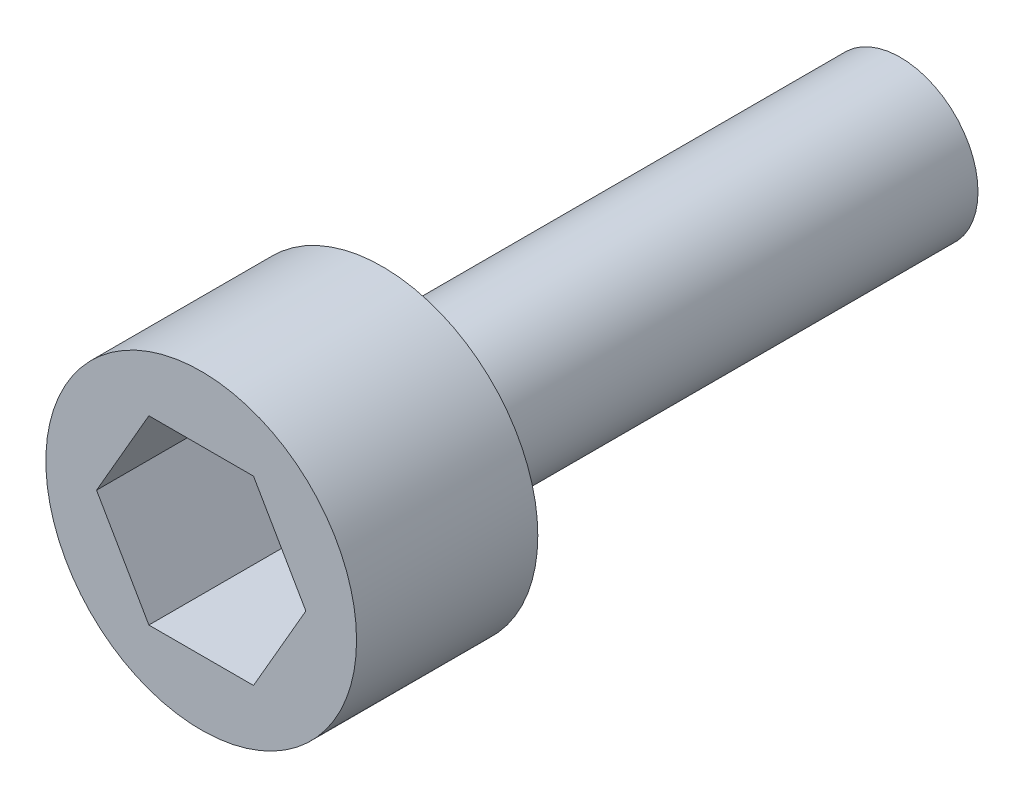
ISO-10303-21;
HEADER;
FILE_DESCRIPTION(('STEP AP214'),'2;1');
FILE_NAME('part.step','',(''),(''),'','','');
FILE_SCHEMA(('AUTOMOTIVE_DESIGN { 1 0 10303 214 1 1 1 1 }'));
ENDSEC;
DATA;
#1=APPLICATION_CONTEXT('core data for automotive mechanical design processes');
#2=APPLICATION_PROTOCOL_DEFINITION('international standard','automotive_design',2000,#1);
#3=PRODUCT_CONTEXT('',#1,'mechanical');
#4=PRODUCT('Part','Part','',(#3));
#5=PRODUCT_RELATED_PRODUCT_CATEGORY('part','',(#4));
#6=PRODUCT_DEFINITION_FORMATION('','',#4);
#7=PRODUCT_DEFINITION_CONTEXT('part definition',#1,'design');
#8=PRODUCT_DEFINITION('design','',#6,#7);
#9=PRODUCT_DEFINITION_SHAPE('','',#8);
#10=(LENGTH_UNIT() NAMED_UNIT(*) SI_UNIT(.MILLI.,.METRE.));
#11=(NAMED_UNIT(*) PLANE_ANGLE_UNIT() SI_UNIT($,.RADIAN.));
#12=(NAMED_UNIT(*) SI_UNIT($,.STERADIAN.) SOLID_ANGLE_UNIT());
#13=UNCERTAINTY_MEASURE_WITH_UNIT(LENGTH_MEASURE(1.E-05),#10,'distance_accuracy_value','');
#14=(GEOMETRIC_REPRESENTATION_CONTEXT(3) GLOBAL_UNCERTAINTY_ASSIGNED_CONTEXT((#13)) GLOBAL_UNIT_ASSIGNED_CONTEXT((#10,
#11,#12)) REPRESENTATION_CONTEXT('',''));
#15=CARTESIAN_POINT('',(0.,0.,0.));
#16=DIRECTION('',(0.,0.,1.));
#17=DIRECTION('',(1.,0.,0.));
#18=AXIS2_PLACEMENT_3D('',#15,#16,#17);
#19=CARTESIAN_POINT('',(0.,0.,3.5));
#20=DIRECTION('',(0.,0.,-1.));
#21=DIRECTION('',(-1.,0.,0.));
#22=AXIS2_PLACEMENT_3D('',#19,#20,#21);
#23=CYLINDRICAL_SURFACE('',#22,3.);
#24=CARTESIAN_POINT('',(0.,0.,3.5));
#25=DIRECTION('',(0.,0.,1.));
#26=DIRECTION('',(1.,0.,0.));
#27=AXIS2_PLACEMENT_3D('',#24,#25,#26);
#28=CIRCLE('',#27,3.);
#29=CARTESIAN_POINT('',(3.,0.,3.5));
#30=VERTEX_POINT('',#29);
#31=EDGE_CURVE('E11',#30,#30,#28,.T.);
#32=ORIENTED_EDGE('',*,*,#31,.F.);
#33=EDGE_LOOP('',(#32));
#34=FACE_BOUND('',#33,.T.);
#35=CARTESIAN_POINT('',(0.,0.,0.));
#36=DIRECTION('',(0.,0.,1.));
#37=DIRECTION('',(1.,0.,0.));
#38=AXIS2_PLACEMENT_3D('',#35,#36,#37);
#39=CIRCLE('',#38,3.);
#40=CARTESIAN_POINT('',(3.,0.,0.));
#41=VERTEX_POINT('',#40);
#42=EDGE_CURVE('E33',#41,#41,#39,.T.);
#43=ORIENTED_EDGE('',*,*,#42,.T.);
#44=EDGE_LOOP('',(#43));
#45=FACE_BOUND('',#44,.T.);
#46=ADVANCED_FACE('F30',(#34,#45),#23,.T.);
#47=CARTESIAN_POINT('',(0.,0.,3.5));
#48=DIRECTION('',(0.,0.,1.));
#49=DIRECTION('',(1.,0.,0.));
#50=AXIS2_PLACEMENT_3D('',#47,#48,#49);
#51=PLANE('',#50);
#52=DIRECTION('',(-0.499999999999528,-0.866025403784711,0.));
#53=VECTOR('',#52,1.);
#54=CARTESIAN_POINT('',(-2.02072594216261,2.1557411053031E-12,3.5));
#55=LINE('',#54,#53);
#56=CARTESIAN_POINT('',(-1.01036297108294,1.75000000000058,3.5));
#57=VERTEX_POINT('',#56);
#58=CARTESIAN_POINT('',(-2.02072594216261,2.15561075933568E-12,3.5));
#59=VERTEX_POINT('',#58);
#60=EDGE_CURVE('E44',#57,#59,#55,.T.);
#61=ORIENTED_EDGE('',*,*,#60,.F.);
#62=DIRECTION('',(-1.,-7.11024037944377E-13,0.));
#63=VECTOR('',#62,1.);
#64=CARTESIAN_POINT('',(-1.01036297108294,1.75000000000058,3.5));
#65=LINE('',#64,#63);
#66=CARTESIAN_POINT('',(1.01036297108301,1.75000000000202,3.5));
#67=VERTEX_POINT('',#66);
#68=EDGE_CURVE('E128',#67,#57,#65,.T.);
#69=ORIENTED_EDGE('',*,*,#68,.F.);
#70=DIRECTION('',(-0.50000000000043,0.86602540378419,0.));
#71=VECTOR('',#70,1.);
#72=CARTESIAN_POINT('',(1.01036297108301,1.75000000000202,3.5));
#73=LINE('',#72,#71);
#74=CARTESIAN_POINT('',(2.02072594216593,2.15574110530311E-12,3.5));
#75=VERTEX_POINT('',#74);
#76=EDGE_CURVE('E126',#75,#67,#73,.T.);
#77=ORIENTED_EDGE('',*,*,#76,.F.);
#78=DIRECTION('',(0.499999999999527,0.866025403784711,0.));
#79=VECTOR('',#78,1.);
#80=CARTESIAN_POINT('',(2.02072594216593,2.15574110530311E-12,3.5));
#81=LINE('',#80,#79);
#82=CARTESIAN_POINT('',(1.01036297108301,-1.75000000000192,3.5));
#83=VERTEX_POINT('',#82);
#84=EDGE_CURVE('E92',#83,#75,#81,.T.);
#85=ORIENTED_EDGE('',*,*,#84,.F.);
#86=DIRECTION('',(1.,7.11024037946673E-13,0.));
#87=VECTOR('',#86,1.);
#88=CARTESIAN_POINT('',(1.01036297108301,-1.75000000000192,3.5));
#89=LINE('',#88,#87);
#90=CARTESIAN_POINT('',(-1.01036297107642,-1.75000000000336,3.5));
#91=VERTEX_POINT('',#90);
#92=EDGE_CURVE('E122',#91,#83,#89,.T.);
#93=ORIENTED_EDGE('',*,*,#92,.F.);
#94=DIRECTION('',(0.500000000000431,-0.86602540378419,0.));
#95=VECTOR('',#94,1.);
#96=CARTESIAN_POINT('',(-1.01036297107642,-1.75000000000336,3.5));
#97=LINE('',#96,#95);
#98=EDGE_CURVE('E118',#59,#91,#97,.T.);
#99=ORIENTED_EDGE('',*,*,#98,.F.);
#100=EDGE_LOOP('',(#61,#69,#77,#85,#93,#99));
#101=FACE_BOUND('',#100,.T.);
#102=ORIENTED_EDGE('',*,*,#31,.T.);
#103=EDGE_LOOP('',(#102));
#104=FACE_BOUND('',#103,.T.);
#105=ADVANCED_FACE('F141',(#101,#104),#51,.T.);
#106=CARTESIAN_POINT('',(0.,0.,0.));
#107=DIRECTION('',(0.,0.,1.));
#108=DIRECTION('',(1.,0.,0.));
#109=AXIS2_PLACEMENT_3D('',#106,#107,#108);
#110=PLANE('',#109);
#111=CARTESIAN_POINT('',(0.,0.,0.));
#112=DIRECTION('',(0.,0.,1.));
#113=DIRECTION('',(1.,0.,0.));
#114=AXIS2_PLACEMENT_3D('',#111,#112,#113);
#115=CIRCLE('',#114,1.5);
#116=CARTESIAN_POINT('',(1.5,0.,0.));
#117=VERTEX_POINT('',#116);
#118=EDGE_CURVE('E148',#117,#117,#115,.T.);
#119=ORIENTED_EDGE('',*,*,#118,.T.);
#120=EDGE_LOOP('',(#119));
#121=FACE_BOUND('',#120,.T.);
#122=ORIENTED_EDGE('',*,*,#42,.F.);
#123=EDGE_LOOP('',(#122));
#124=FACE_BOUND('',#123,.T.);
#125=ADVANCED_FACE('F169',(#121,#124),#110,.F.);
#126=CARTESIAN_POINT('',(-2.02072594216261,2.1557411053031E-12,0.7));
#127=DIRECTION('',(-0.866025403784711,0.499999999999528,0.));
#128=DIRECTION('',(-0.499999999999528,-0.866025403784711,0.));
#129=AXIS2_PLACEMENT_3D('',#126,#127,#128);
#130=PLANE('',#129);
#131=ORIENTED_EDGE('',*,*,#60,.T.);
#132=DIRECTION('',(0.,0.,1.));
#133=VECTOR('',#132,1.);
#134=CARTESIAN_POINT('',(-2.02072594216261,2.1557411053031E-12,0.7));
#135=LINE('',#134,#133);
#136=CARTESIAN_POINT('',(-2.02072594216261,2.1557411053031E-12,0.7));
#137=VERTEX_POINT('',#136);
#138=EDGE_CURVE('E74',#137,#59,#135,.T.);
#139=ORIENTED_EDGE('',*,*,#138,.F.);
#140=DIRECTION('',(-0.499999999999528,-0.866025403784711,0.));
#141=VECTOR('',#140,1.);
#142=CARTESIAN_POINT('',(-2.02072594216261,2.1557411053031E-12,0.7));
#143=LINE('',#142,#141);
#144=CARTESIAN_POINT('',(-1.01036297108294,1.75000000000058,0.7));
#145=VERTEX_POINT('',#144);
#146=EDGE_CURVE('E130',#145,#137,#143,.T.);
#147=ORIENTED_EDGE('',*,*,#146,.F.);
#148=DIRECTION('',(0.,0.,1.));
#149=VECTOR('',#148,1.);
#150=CARTESIAN_POINT('',(-1.01036297108294,1.75000000000058,0.7));
#151=LINE('',#150,#149);
#152=EDGE_CURVE('E52',#145,#57,#151,.T.);
#153=ORIENTED_EDGE('',*,*,#152,.T.);
#154=EDGE_LOOP('',(#131,#139,#147,#153));
#155=FACE_BOUND('',#154,.T.);
#156=ADVANCED_FACE('F177',(#155),#130,.F.);
#157=CARTESIAN_POINT('',(-1.01036297108294,1.75000000000058,0.7));
#158=DIRECTION('',(-7.11024037944377E-13,1.,0.));
#159=DIRECTION('',(-1.,-7.11024037944377E-13,0.));
#160=AXIS2_PLACEMENT_3D('',#157,#158,#159);
#161=PLANE('',#160);
#162=ORIENTED_EDGE('',*,*,#68,.T.);
#163=ORIENTED_EDGE('',*,*,#152,.F.);
#164=DIRECTION('',(-1.,-7.11024037944377E-13,0.));
#165=VECTOR('',#164,1.);
#166=CARTESIAN_POINT('',(-1.01036297108294,1.75000000000058,0.7));
#167=LINE('',#166,#165);
#168=CARTESIAN_POINT('',(1.01036297108301,1.75000000000202,0.7));
#169=VERTEX_POINT('',#168);
#170=EDGE_CURVE('E104',#169,#145,#167,.T.);
#171=ORIENTED_EDGE('',*,*,#170,.F.);
#172=DIRECTION('',(0.,0.,1.));
#173=VECTOR('',#172,1.);
#174=CARTESIAN_POINT('',(1.01036297108301,1.75000000000202,0.7));
#175=LINE('',#174,#173);
#176=EDGE_CURVE('E96',#169,#67,#175,.T.);
#177=ORIENTED_EDGE('',*,*,#176,.T.);
#178=EDGE_LOOP('',(#162,#163,#171,#177));
#179=FACE_BOUND('',#178,.T.);
#180=ADVANCED_FACE('F182',(#179),#161,.F.);
#181=CARTESIAN_POINT('',(1.01036297108301,1.75000000000202,0.7));
#182=DIRECTION('',(0.86602540378419,0.50000000000043,0.));
#183=DIRECTION('',(-0.50000000000043,0.86602540378419,0.));
#184=AXIS2_PLACEMENT_3D('',#181,#182,#183);
#185=PLANE('',#184);
#186=ORIENTED_EDGE('',*,*,#76,.T.);
#187=ORIENTED_EDGE('',*,*,#176,.F.);
#188=DIRECTION('',(-0.50000000000043,0.86602540378419,0.));
#189=VECTOR('',#188,1.);
#190=CARTESIAN_POINT('',(1.01036297108301,1.75000000000202,0.7));
#191=LINE('',#190,#189);
#192=CARTESIAN_POINT('',(2.02072594216593,2.15574110530311E-12,0.7));
#193=VERTEX_POINT('',#192);
#194=EDGE_CURVE('E100',#193,#169,#191,.T.);
#195=ORIENTED_EDGE('',*,*,#194,.F.);
#196=DIRECTION('',(0.,0.,1.));
#197=VECTOR('',#196,1.);
#198=CARTESIAN_POINT('',(2.02072594216593,2.15574110530311E-12,0.7));
#199=LINE('',#198,#197);
#200=EDGE_CURVE('E85',#193,#75,#199,.T.);
#201=ORIENTED_EDGE('',*,*,#200,.T.);
#202=EDGE_LOOP('',(#186,#187,#195,#201));
#203=FACE_BOUND('',#202,.T.);
#204=ADVANCED_FACE('F101',(#203),#185,.F.);
#205=CARTESIAN_POINT('',(2.02072594216593,2.15574110530311E-12,0.7));
#206=DIRECTION('',(0.866025403784712,-0.499999999999527,0.));
#207=DIRECTION('',(0.499999999999527,0.866025403784712,0.));
#208=AXIS2_PLACEMENT_3D('',#205,#206,#207);
#209=PLANE('',#208);
#210=ORIENTED_EDGE('',*,*,#84,.T.);
#211=ORIENTED_EDGE('',*,*,#200,.F.);
#212=DIRECTION('',(0.499999999999527,0.866025403784711,0.));
#213=VECTOR('',#212,1.);
#214=CARTESIAN_POINT('',(2.02072594216593,2.15574110530311E-12,0.7));
#215=LINE('',#214,#213);
#216=CARTESIAN_POINT('',(1.01036297108301,-1.75000000000192,0.7));
#217=VERTEX_POINT('',#216);
#218=EDGE_CURVE('E89',#217,#193,#215,.T.);
#219=ORIENTED_EDGE('',*,*,#218,.F.);
#220=DIRECTION('',(0.,0.,1.));
#221=VECTOR('',#220,1.);
#222=CARTESIAN_POINT('',(1.01036297108301,-1.75000000000192,0.7));
#223=LINE('',#222,#221);
#224=EDGE_CURVE('E97',#217,#83,#223,.T.);
#225=ORIENTED_EDGE('',*,*,#224,.T.);
#226=EDGE_LOOP('',(#210,#211,#219,#225));
#227=FACE_BOUND('',#226,.T.);
#228=ADVANCED_FACE('F87',(#227),#209,.F.);
#229=CARTESIAN_POINT('',(1.01036297108301,-1.75000000000192,0.7));
#230=DIRECTION('',(7.11024037946673E-13,-1.,0.));
#231=DIRECTION('',(1.,7.11024037946673E-13,0.));
#232=AXIS2_PLACEMENT_3D('',#229,#230,#231);
#233=PLANE('',#232);
#234=ORIENTED_EDGE('',*,*,#92,.T.);
#235=ORIENTED_EDGE('',*,*,#224,.F.);
#236=DIRECTION('',(1.,7.11024037946673E-13,0.));
#237=VECTOR('',#236,1.);
#238=CARTESIAN_POINT('',(1.01036297108301,-1.75000000000192,0.7));
#239=LINE('',#238,#237);
#240=CARTESIAN_POINT('',(-1.01036297107642,-1.75000000000336,0.7));
#241=VERTEX_POINT('',#240);
#242=EDGE_CURVE('E110',#241,#217,#239,.T.);
#243=ORIENTED_EDGE('',*,*,#242,.F.);
#244=DIRECTION('',(0.,0.,1.));
#245=VECTOR('',#244,1.);
#246=CARTESIAN_POINT('',(-1.01036297107642,-1.75000000000336,0.7));
#247=LINE('',#246,#245);
#248=EDGE_CURVE('E134',#241,#91,#247,.T.);
#249=ORIENTED_EDGE('',*,*,#248,.T.);
#250=EDGE_LOOP('',(#234,#235,#243,#249));
#251=FACE_BOUND('',#250,.T.);
#252=ADVANCED_FACE('F145',(#251),#233,.F.);
#253=CARTESIAN_POINT('',(-1.01036297107642,-1.75000000000336,0.7));
#254=DIRECTION('',(-0.86602540378419,-0.500000000000431,0.));
#255=DIRECTION('',(0.500000000000431,-0.86602540378419,0.));
#256=AXIS2_PLACEMENT_3D('',#253,#254,#255);
#257=PLANE('',#256);
#258=ORIENTED_EDGE('',*,*,#98,.T.);
#259=ORIENTED_EDGE('',*,*,#248,.F.);
#260=DIRECTION('',(0.500000000000431,-0.86602540378419,0.));
#261=VECTOR('',#260,1.);
#262=CARTESIAN_POINT('',(-1.01036297107642,-1.75000000000336,0.7));
#263=LINE('',#262,#261);
#264=EDGE_CURVE('E112',#137,#241,#263,.T.);
#265=ORIENTED_EDGE('',*,*,#264,.F.);
#266=ORIENTED_EDGE('',*,*,#138,.T.);
#267=EDGE_LOOP('',(#258,#259,#265,#266));
#268=FACE_BOUND('',#267,.T.);
#269=ADVANCED_FACE('F138',(#268),#257,.F.);
#270=CARTESIAN_POINT('',(-1.01036297108294,1.75000000000058,0.7));
#271=DIRECTION('',(0.,0.,-1.));
#272=DIRECTION('',(-1.,0.,0.));
#273=AXIS2_PLACEMENT_3D('',#270,#271,#272);
#274=PLANE('',#273);
#275=ORIENTED_EDGE('',*,*,#146,.T.);
#276=ORIENTED_EDGE('',*,*,#264,.T.);
#277=ORIENTED_EDGE('',*,*,#242,.T.);
#278=ORIENTED_EDGE('',*,*,#218,.T.);
#279=ORIENTED_EDGE('',*,*,#194,.T.);
#280=ORIENTED_EDGE('',*,*,#170,.T.);
#281=EDGE_LOOP('',(#275,#276,#277,#278,#279,#280));
#282=FACE_BOUND('',#281,.T.);
#283=ADVANCED_FACE('F107',(#282),#274,.F.);
#284=CARTESIAN_POINT('',(0.,0.,-10.));
#285=DIRECTION('',(0.,0.,1.));
#286=DIRECTION('',(1.,0.,0.));
#287=AXIS2_PLACEMENT_3D('',#284,#285,#286);
#288=CYLINDRICAL_SURFACE('',#287,1.5);
#289=CARTESIAN_POINT('',(0.,0.,-10.));
#290=DIRECTION('',(0.,0.,1.));
#291=DIRECTION('',(1.,0.,0.));
#292=AXIS2_PLACEMENT_3D('',#289,#290,#291);
#293=CIRCLE('',#292,1.5);
#294=CARTESIAN_POINT('',(1.5,0.,-10.));
#295=VERTEX_POINT('',#294);
#296=EDGE_CURVE('E119',#295,#295,#293,.T.);
#297=ORIENTED_EDGE('',*,*,#296,.T.);
#298=EDGE_LOOP('',(#297));
#299=FACE_BOUND('',#298,.T.);
#300=ORIENTED_EDGE('',*,*,#118,.F.);
#301=EDGE_LOOP('',(#300));
#302=FACE_BOUND('',#301,.T.);
#303=ADVANCED_FACE('F154',(#299,#302),#288,.T.);
#304=CARTESIAN_POINT('',(0.,0.,-10.));
#305=DIRECTION('',(0.,0.,1.));
#306=DIRECTION('',(1.,0.,0.));
#307=AXIS2_PLACEMENT_3D('',#304,#305,#306);
#308=PLANE('',#307);
#309=ORIENTED_EDGE('',*,*,#296,.F.);
#310=EDGE_LOOP('',(#309));
#311=FACE_BOUND('',#310,.T.);
#312=ADVANCED_FACE('F157',(#311),#308,.F.);
#313=CLOSED_SHELL('',(#46,#105,#125,#156,#180,#204,#228,#252,#269,#283,#303,#312));
#314=MANIFOLD_SOLID_BREP('B2',#313);
#315=ADVANCED_BREP_SHAPE_REPRESENTATION('',(#18,#314),#14);
#316=SHAPE_DEFINITION_REPRESENTATION(#9,#315);
ENDSEC;
END-ISO-10303-21;
